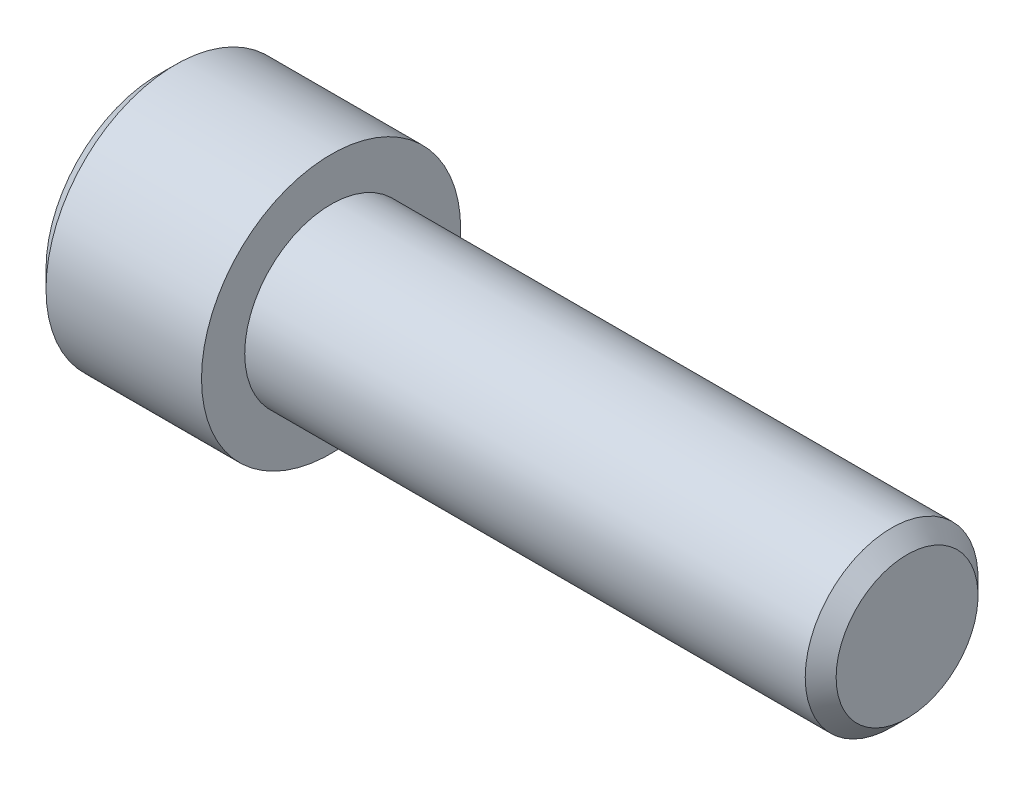
ISO-10303-21;
HEADER;
FILE_DESCRIPTION(('STEP AP214'),'2;1');
FILE_NAME('part.step','',(''),(''),'','','');
FILE_SCHEMA(('AUTOMOTIVE_DESIGN { 1 0 10303 214 1 1 1 1 }'));
ENDSEC;
DATA;
#1=APPLICATION_CONTEXT('core data for automotive mechanical design processes');
#2=APPLICATION_PROTOCOL_DEFINITION('international standard','automotive_design',2000,#1);
#3=PRODUCT_CONTEXT('',#1,'mechanical');
#4=PRODUCT('Part','Part','',(#3));
#5=PRODUCT_RELATED_PRODUCT_CATEGORY('part','',(#4));
#6=PRODUCT_DEFINITION_FORMATION('','',#4);
#7=PRODUCT_DEFINITION_CONTEXT('part definition',#1,'design');
#8=PRODUCT_DEFINITION('design','',#6,#7);
#9=PRODUCT_DEFINITION_SHAPE('','',#8);
#10=(LENGTH_UNIT() NAMED_UNIT(*) SI_UNIT(.MILLI.,.METRE.));
#11=(NAMED_UNIT(*) PLANE_ANGLE_UNIT() SI_UNIT($,.RADIAN.));
#12=(NAMED_UNIT(*) SI_UNIT($,.STERADIAN.) SOLID_ANGLE_UNIT());
#13=UNCERTAINTY_MEASURE_WITH_UNIT(LENGTH_MEASURE(1.E-05),#10,'distance_accuracy_value','');
#14=(GEOMETRIC_REPRESENTATION_CONTEXT(3) GLOBAL_UNCERTAINTY_ASSIGNED_CONTEXT((#13)) GLOBAL_UNIT_ASSIGNED_CONTEXT((#10,
#11,#12)) REPRESENTATION_CONTEXT('',''));
#15=CARTESIAN_POINT('',(0.,0.,0.));
#16=DIRECTION('',(0.,0.,1.));
#17=DIRECTION('',(1.,0.,0.));
#18=AXIS2_PLACEMENT_3D('',#15,#16,#17);
#19=CARTESIAN_POINT('',(-6.00000000000023,0.,0.));
#20=DIRECTION('',(-1.,0.,0.));
#21=DIRECTION('',(0.,-1.,0.));
#22=AXIS2_PLACEMENT_3D('',#19,#20,#21);
#23=CONICAL_SURFACE('',#22,4.99999999999545,1.30899693900325);
#24=CARTESIAN_POINT('',(-4.66025403790127,0.,5.6843418860808E-11));
#25=VERTEX_POINT('',#24);
#26=VERTEX_LOOP('',#25);
#27=FACE_BOUND('',#26,.T.);
#28=CARTESIAN_POINT('',(-6.00000000000023,0.,0.));
#29=DIRECTION('',(-1.,0.,0.));
#30=DIRECTION('',(0.,-1.,0.));
#31=AXIS2_PLACEMENT_3D('',#28,#29,#30);
#32=CIRCLE('',#31,4.99999999999545);
#33=CARTESIAN_POINT('',(-6.00000000000011,4.33012701892022,-2.49999999999886));
#34=VERTEX_POINT('',#33);
#35=CARTESIAN_POINT('',(-6.00000000000011,0.,-4.99999999999773));
#36=VERTEX_POINT('',#35);
#37=EDGE_CURVE('E152',#34,#36,#32,.T.);
#38=ORIENTED_EDGE('',*,*,#37,.T.);
#39=CARTESIAN_POINT('',(-6.00000000000023,0.,0.));
#40=DIRECTION('',(-1.,0.,0.));
#41=DIRECTION('',(0.,-1.,0.));
#42=AXIS2_PLACEMENT_3D('',#39,#40,#41);
#43=CIRCLE('',#42,4.99999999999545);
#44=CARTESIAN_POINT('',(-6.00000000000011,-4.33012701892022,-2.49999999999887));
#45=VERTEX_POINT('',#44);
#46=EDGE_CURVE('E136',#36,#45,#43,.T.);
#47=ORIENTED_EDGE('',*,*,#46,.T.);
#48=CARTESIAN_POINT('',(-6.00000000000023,0.,0.));
#49=DIRECTION('',(-1.,0.,0.));
#50=DIRECTION('',(0.,-1.,0.));
#51=AXIS2_PLACEMENT_3D('',#48,#49,#50);
#52=CIRCLE('',#51,4.99999999999545);
#53=CARTESIAN_POINT('',(-6.00000000000011,-4.33012701892022,2.49999999999886));
#54=VERTEX_POINT('',#53);
#55=EDGE_CURVE('E89',#45,#54,#52,.T.);
#56=ORIENTED_EDGE('',*,*,#55,.T.);
#57=CARTESIAN_POINT('',(-6.00000000000023,0.,0.));
#58=DIRECTION('',(-1.,0.,0.));
#59=DIRECTION('',(0.,-1.,0.));
#60=AXIS2_PLACEMENT_3D('',#57,#58,#59);
#61=CIRCLE('',#60,4.99999999999545);
#62=CARTESIAN_POINT('',(-6.00000000000011,0.,4.99999999999773));
#63=VERTEX_POINT('',#62);
#64=EDGE_CURVE('E20',#54,#63,#61,.T.);
#65=ORIENTED_EDGE('',*,*,#64,.T.);
#66=CARTESIAN_POINT('',(-6.00000000000023,0.,0.));
#67=DIRECTION('',(-1.,0.,0.));
#68=DIRECTION('',(0.,-1.,0.));
#69=AXIS2_PLACEMENT_3D('',#66,#67,#68);
#70=CIRCLE('',#69,4.99999999999545);
#71=CARTESIAN_POINT('',(-6.00000000000011,4.33012701892022,2.49999999999887));
#72=VERTEX_POINT('',#71);
#73=EDGE_CURVE('E92',#63,#72,#70,.T.);
#74=ORIENTED_EDGE('',*,*,#73,.T.);
#75=CARTESIAN_POINT('',(-6.00000000000023,0.,0.));
#76=DIRECTION('',(-1.,0.,0.));
#77=DIRECTION('',(0.,-1.,0.));
#78=AXIS2_PLACEMENT_3D('',#75,#76,#77);
#79=CIRCLE('',#78,4.99999999999545);
#80=EDGE_CURVE('E106',#72,#34,#79,.T.);
#81=ORIENTED_EDGE('',*,*,#80,.T.);
#82=EDGE_LOOP('',(#38,#47,#56,#65,#74,#81));
#83=FACE_BOUND('',#82,.T.);
#84=ADVANCED_FACE('F17',(#27,#83),#23,.F.);
#85=CARTESIAN_POINT('',(-6.,0.,0.));
#86=DIRECTION('',(1.,0.,0.));
#87=DIRECTION('',(0.,0.,-1.));
#88=AXIS2_PLACEMENT_3D('',#85,#86,#87);
#89=PLANE('',#88);
#90=DIRECTION('',(0.,0.5,0.866025403784439));
#91=VECTOR('',#90,1.);
#92=CARTESIAN_POINT('',(-6.,-2.88675134594813,5.));
#93=LINE('',#92,#91);
#94=CARTESIAN_POINT('',(-6.,-2.88675134594813,5.));
#95=VERTEX_POINT('',#94);
#96=EDGE_CURVE('E111',#95,#54,#93,.F.);
#97=ORIENTED_EDGE('',*,*,#96,.F.);
#98=DIRECTION('',(0.,1.,0.));
#99=VECTOR('',#98,1.);
#100=CARTESIAN_POINT('',(-6.,2.88675134594813,5.));
#101=LINE('',#100,#99);
#102=EDGE_CURVE('E108',#63,#95,#101,.F.);
#103=ORIENTED_EDGE('',*,*,#102,.F.);
#104=ORIENTED_EDGE('',*,*,#64,.F.);
#105=EDGE_LOOP('',(#97,#103,#104));
#106=FACE_BOUND('',#105,.T.);
#107=ADVANCED_FACE('F109',(#106),#89,.F.);
#108=CARTESIAN_POINT('',(-6.,0.,0.));
#109=DIRECTION('',(1.,0.,0.));
#110=DIRECTION('',(0.,0.,-1.));
#111=AXIS2_PLACEMENT_3D('',#108,#109,#110);
#112=PLANE('',#111);
#113=DIRECTION('',(0.,1.,0.));
#114=VECTOR('',#113,1.);
#115=CARTESIAN_POINT('',(-6.,2.88675134594813,5.));
#116=LINE('',#115,#114);
#117=CARTESIAN_POINT('',(-6.,2.88675134594813,5.));
#118=VERTEX_POINT('',#117);
#119=EDGE_CURVE('E101',#118,#63,#116,.F.);
#120=ORIENTED_EDGE('',*,*,#119,.F.);
#121=DIRECTION('',(0.,0.5,-0.866025403784439));
#122=VECTOR('',#121,1.);
#123=CARTESIAN_POINT('',(-6.,5.77350269189626,0.));
#124=LINE('',#123,#122);
#125=EDGE_CURVE('E104',#72,#118,#124,.F.);
#126=ORIENTED_EDGE('',*,*,#125,.F.);
#127=ORIENTED_EDGE('',*,*,#73,.F.);
#128=EDGE_LOOP('',(#120,#126,#127));
#129=FACE_BOUND('',#128,.T.);
#130=ADVANCED_FACE('F99',(#129),#112,.F.);
#131=CARTESIAN_POINT('',(-6.,0.,0.));
#132=DIRECTION('',(1.,0.,0.));
#133=DIRECTION('',(0.,0.,-1.));
#134=AXIS2_PLACEMENT_3D('',#131,#132,#133);
#135=PLANE('',#134);
#136=ORIENTED_EDGE('',*,*,#80,.F.);
#137=DIRECTION('',(0.,0.5,-0.866025403784439));
#138=VECTOR('',#137,1.);
#139=CARTESIAN_POINT('',(-6.,5.77350269189626,0.));
#140=LINE('',#139,#138);
#141=CARTESIAN_POINT('',(-6.,5.77350269189626,0.));
#142=VERTEX_POINT('',#141);
#143=EDGE_CURVE('E132',#142,#72,#140,.F.);
#144=ORIENTED_EDGE('',*,*,#143,.F.);
#145=DIRECTION('',(0.,-0.5,-0.866025403784439));
#146=VECTOR('',#145,1.);
#147=CARTESIAN_POINT('',(-6.,2.88675134594813,-5.));
#148=LINE('',#147,#146);
#149=EDGE_CURVE('E168',#34,#142,#148,.F.);
#150=ORIENTED_EDGE('',*,*,#149,.F.);
#151=EDGE_LOOP('',(#136,#144,#150));
#152=FACE_BOUND('',#151,.T.);
#153=ADVANCED_FACE('F169',(#152),#135,.F.);
#154=CARTESIAN_POINT('',(-6.,0.,0.));
#155=DIRECTION('',(1.,0.,0.));
#156=DIRECTION('',(0.,0.,-1.));
#157=AXIS2_PLACEMENT_3D('',#154,#155,#156);
#158=PLANE('',#157);
#159=DIRECTION('',(0.,-0.5,-0.866025403784439));
#160=VECTOR('',#159,1.);
#161=CARTESIAN_POINT('',(-6.,2.88675134594813,-5.));
#162=LINE('',#161,#160);
#163=CARTESIAN_POINT('',(-6.,2.88675134594813,-5.));
#164=VERTEX_POINT('',#163);
#165=EDGE_CURVE('E162',#164,#34,#162,.F.);
#166=ORIENTED_EDGE('',*,*,#165,.F.);
#167=DIRECTION('',(0.,1.,0.));
#168=VECTOR('',#167,1.);
#169=CARTESIAN_POINT('',(-6.,-2.88675134594813,-5.));
#170=LINE('',#169,#168);
#171=EDGE_CURVE('E165',#36,#164,#170,.T.);
#172=ORIENTED_EDGE('',*,*,#171,.F.);
#173=ORIENTED_EDGE('',*,*,#37,.F.);
#174=EDGE_LOOP('',(#166,#172,#173));
#175=FACE_BOUND('',#174,.T.);
#176=ADVANCED_FACE('F160',(#175),#158,.F.);
#177=CARTESIAN_POINT('',(-6.,0.,0.));
#178=DIRECTION('',(1.,0.,0.));
#179=DIRECTION('',(0.,0.,-1.));
#180=AXIS2_PLACEMENT_3D('',#177,#178,#179);
#181=PLANE('',#180);
#182=DIRECTION('',(0.,-0.5,0.866025403784439));
#183=VECTOR('',#182,1.);
#184=CARTESIAN_POINT('',(-6.,-5.77350269189626,0.));
#185=LINE('',#184,#183);
#186=CARTESIAN_POINT('',(-6.,-5.77350269189626,0.));
#187=VERTEX_POINT('',#186);
#188=EDGE_CURVE('E214',#187,#45,#185,.F.);
#189=ORIENTED_EDGE('',*,*,#188,.F.);
#190=DIRECTION('',(0.,0.5,0.866025403784439));
#191=VECTOR('',#190,1.);
#192=CARTESIAN_POINT('',(-6.,-2.88675134594813,5.));
#193=LINE('',#192,#191);
#194=EDGE_CURVE('E120',#54,#187,#193,.F.);
#195=ORIENTED_EDGE('',*,*,#194,.F.);
#196=ORIENTED_EDGE('',*,*,#55,.F.);
#197=EDGE_LOOP('',(#189,#195,#196));
#198=FACE_BOUND('',#197,.T.);
#199=ADVANCED_FACE('F253',(#198),#181,.F.);
#200=CARTESIAN_POINT('',(-6.,0.,0.));
#201=DIRECTION('',(1.,0.,0.));
#202=DIRECTION('',(0.,0.,-1.));
#203=AXIS2_PLACEMENT_3D('',#200,#201,#202);
#204=PLANE('',#203);
#205=DIRECTION('',(0.,1.,0.));
#206=VECTOR('',#205,1.);
#207=CARTESIAN_POINT('',(-6.,-2.88675134594813,-5.));
#208=LINE('',#207,#206);
#209=CARTESIAN_POINT('',(-6.,-2.88675134594813,-5.));
#210=VERTEX_POINT('',#209);
#211=EDGE_CURVE('E187',#210,#36,#208,.T.);
#212=ORIENTED_EDGE('',*,*,#211,.F.);
#213=DIRECTION('',(0.,-0.5,0.866025403784439));
#214=VECTOR('',#213,1.);
#215=CARTESIAN_POINT('',(-6.,-5.77350269189626,0.));
#216=LINE('',#215,#214);
#217=EDGE_CURVE('E217',#45,#210,#216,.F.);
#218=ORIENTED_EDGE('',*,*,#217,.F.);
#219=ORIENTED_EDGE('',*,*,#46,.F.);
#220=EDGE_LOOP('',(#212,#218,#219));
#221=FACE_BOUND('',#220,.T.);
#222=ADVANCED_FACE('F250',(#221),#204,.F.);
#223=CARTESIAN_POINT('',(-6.,-2.88675134594813,5.));
#224=DIRECTION('',(0.,0.866025403784439,-0.5));
#225=DIRECTION('',(0.,0.5,0.866025403784439));
#226=AXIS2_PLACEMENT_3D('',#223,#224,#225);
#227=PLANE('',#226);
#228=ORIENTED_EDGE('',*,*,#194,.T.);
#229=DIRECTION('',(1.,0.,0.));
#230=VECTOR('',#229,1.);
#231=CARTESIAN_POINT('',(-6.,-5.77350269189626,0.));
#232=LINE('',#231,#230);
#233=CARTESIAN_POINT('',(-12.,-5.77350269189626,0.));
#234=VERTEX_POINT('',#233);
#235=EDGE_CURVE('E218',#234,#187,#232,.T.);
#236=ORIENTED_EDGE('',*,*,#235,.F.);
#237=DIRECTION('',(0.,0.5,0.866025403784439));
#238=VECTOR('',#237,1.);
#239=CARTESIAN_POINT('',(-12.,-5.77350269189626,0.));
#240=LINE('',#239,#238);
#241=CARTESIAN_POINT('',(-12.,-2.88675134594813,5.));
#242=VERTEX_POINT('',#241);
#243=EDGE_CURVE('E213',#234,#242,#240,.T.);
#244=ORIENTED_EDGE('',*,*,#243,.T.);
#245=DIRECTION('',(-1.,0.,0.));
#246=VECTOR('',#245,1.);
#247=CARTESIAN_POINT('',(-6.,-2.88675134594813,5.));
#248=LINE('',#247,#246);
#249=EDGE_CURVE('E115',#95,#242,#248,.T.);
#250=ORIENTED_EDGE('',*,*,#249,.F.);
#251=ORIENTED_EDGE('',*,*,#96,.T.);
#252=EDGE_LOOP('',(#228,#236,#244,#250,#251));
#253=FACE_BOUND('',#252,.T.);
#254=ADVANCED_FACE('F255',(#253),#227,.T.);
#255=CARTESIAN_POINT('',(-6.,2.88675134594813,5.));
#256=DIRECTION('',(0.,0.,-1.));
#257=DIRECTION('',(-1.,0.,0.));
#258=AXIS2_PLACEMENT_3D('',#255,#256,#257);
#259=PLANE('',#258);
#260=ORIENTED_EDGE('',*,*,#102,.T.);
#261=ORIENTED_EDGE('',*,*,#249,.T.);
#262=DIRECTION('',(0.,1.,0.));
#263=VECTOR('',#262,1.);
#264=CARTESIAN_POINT('',(-12.,0.,5.));
#265=LINE('',#264,#263);
#266=CARTESIAN_POINT('',(-12.,2.88675134594813,5.));
#267=VERTEX_POINT('',#266);
#268=EDGE_CURVE('E208',#242,#267,#265,.T.);
#269=ORIENTED_EDGE('',*,*,#268,.T.);
#270=DIRECTION('',(1.,0.,0.));
#271=VECTOR('',#270,1.);
#272=CARTESIAN_POINT('',(-6.,2.88675134594813,5.));
#273=LINE('',#272,#271);
#274=EDGE_CURVE('E119',#118,#267,#273,.F.);
#275=ORIENTED_EDGE('',*,*,#274,.F.);
#276=ORIENTED_EDGE('',*,*,#119,.T.);
#277=EDGE_LOOP('',(#260,#261,#269,#275,#276));
#278=FACE_BOUND('',#277,.T.);
#279=ADVANCED_FACE('F117',(#278),#259,.T.);
#280=CARTESIAN_POINT('',(-6.,5.77350269189626,0.));
#281=DIRECTION('',(0.,-0.866025403784439,-0.5));
#282=DIRECTION('',(0.,0.5,-0.866025403784439));
#283=AXIS2_PLACEMENT_3D('',#280,#281,#282);
#284=PLANE('',#283);
#285=ORIENTED_EDGE('',*,*,#125,.T.);
#286=ORIENTED_EDGE('',*,*,#274,.T.);
#287=DIRECTION('',(0.,0.5,-0.866025403784439));
#288=VECTOR('',#287,1.);
#289=CARTESIAN_POINT('',(-12.,2.88675134594813,5.));
#290=LINE('',#289,#288);
#291=CARTESIAN_POINT('',(-12.,5.77350269189626,0.));
#292=VERTEX_POINT('',#291);
#293=EDGE_CURVE('E198',#267,#292,#290,.T.);
#294=ORIENTED_EDGE('',*,*,#293,.T.);
#295=DIRECTION('',(1.,0.,0.));
#296=VECTOR('',#295,1.);
#297=CARTESIAN_POINT('',(-6.,5.77350269189626,0.));
#298=LINE('',#297,#296);
#299=EDGE_CURVE('E173',#142,#292,#298,.F.);
#300=ORIENTED_EDGE('',*,*,#299,.F.);
#301=ORIENTED_EDGE('',*,*,#143,.T.);
#302=EDGE_LOOP('',(#285,#286,#294,#300,#301));
#303=FACE_BOUND('',#302,.T.);
#304=ADVANCED_FACE('F196',(#303),#284,.T.);
#305=CARTESIAN_POINT('',(-6.,2.88675134594813,-5.));
#306=DIRECTION('',(0.,-0.866025403784439,0.5));
#307=DIRECTION('',(0.,-0.5,-0.866025403784439));
#308=AXIS2_PLACEMENT_3D('',#305,#306,#307);
#309=PLANE('',#308);
#310=ORIENTED_EDGE('',*,*,#149,.T.);
#311=ORIENTED_EDGE('',*,*,#299,.T.);
#312=DIRECTION('',(0.,-0.5,-0.866025403784439));
#313=VECTOR('',#312,1.);
#314=CARTESIAN_POINT('',(-12.,5.77350269189626,0.));
#315=LINE('',#314,#313);
#316=CARTESIAN_POINT('',(-12.,2.88675134594813,-5.));
#317=VERTEX_POINT('',#316);
#318=EDGE_CURVE('E200',#292,#317,#315,.T.);
#319=ORIENTED_EDGE('',*,*,#318,.T.);
#320=DIRECTION('',(1.,0.,0.));
#321=VECTOR('',#320,1.);
#322=CARTESIAN_POINT('',(-6.,2.88675134594813,-5.));
#323=LINE('',#322,#321);
#324=EDGE_CURVE('E176',#164,#317,#323,.F.);
#325=ORIENTED_EDGE('',*,*,#324,.F.);
#326=ORIENTED_EDGE('',*,*,#165,.T.);
#327=EDGE_LOOP('',(#310,#311,#319,#325,#326));
#328=FACE_BOUND('',#327,.T.);
#329=ADVANCED_FACE('F175',(#328),#309,.T.);
#330=CARTESIAN_POINT('',(-6.,-2.88675134594813,-5.));
#331=DIRECTION('',(0.,0.,1.));
#332=DIRECTION('',(1.,0.,0.));
#333=AXIS2_PLACEMENT_3D('',#330,#331,#332);
#334=PLANE('',#333);
#335=ORIENTED_EDGE('',*,*,#171,.T.);
#336=ORIENTED_EDGE('',*,*,#324,.T.);
#337=DIRECTION('',(0.,1.,0.));
#338=VECTOR('',#337,1.);
#339=CARTESIAN_POINT('',(-12.,0.,-5.));
#340=LINE('',#339,#338);
#341=CARTESIAN_POINT('',(-12.,-2.88675134594813,-5.));
#342=VERTEX_POINT('',#341);
#343=EDGE_CURVE('E35',#317,#342,#340,.F.);
#344=ORIENTED_EDGE('',*,*,#343,.T.);
#345=DIRECTION('',(1.,0.,0.));
#346=VECTOR('',#345,1.);
#347=CARTESIAN_POINT('',(-6.,-2.88675134594813,-5.));
#348=LINE('',#347,#346);
#349=EDGE_CURVE('E223',#210,#342,#348,.F.);
#350=ORIENTED_EDGE('',*,*,#349,.F.);
#351=ORIENTED_EDGE('',*,*,#211,.T.);
#352=EDGE_LOOP('',(#335,#336,#344,#350,#351));
#353=FACE_BOUND('',#352,.T.);
#354=ADVANCED_FACE('F247',(#353),#334,.T.);
#355=CARTESIAN_POINT('',(-6.,-5.77350269189626,0.));
#356=DIRECTION('',(0.,0.866025403784439,0.5));
#357=DIRECTION('',(0.,-0.5,0.866025403784439));
#358=AXIS2_PLACEMENT_3D('',#355,#356,#357);
#359=PLANE('',#358);
#360=ORIENTED_EDGE('',*,*,#217,.T.);
#361=ORIENTED_EDGE('',*,*,#349,.T.);
#362=DIRECTION('',(0.,-0.5,0.866025403784439));
#363=VECTOR('',#362,1.);
#364=CARTESIAN_POINT('',(-12.,-2.88675134594813,-5.));
#365=LINE('',#364,#363);
#366=EDGE_CURVE('E149',#342,#234,#365,.T.);
#367=ORIENTED_EDGE('',*,*,#366,.T.);
#368=ORIENTED_EDGE('',*,*,#235,.T.);
#369=ORIENTED_EDGE('',*,*,#188,.T.);
#370=EDGE_LOOP('',(#360,#361,#367,#368,#369));
#371=FACE_BOUND('',#370,.T.);
#372=ADVANCED_FACE('F258',(#371),#359,.T.);
#373=CARTESIAN_POINT('',(-12.,0.,0.));
#374=DIRECTION('',(1.,0.,0.));
#375=DIRECTION('',(0.,0.,-1.));
#376=AXIS2_PLACEMENT_3D('',#373,#374,#375);
#377=PLANE('',#376);
#378=ORIENTED_EDGE('',*,*,#343,.F.);
#379=ORIENTED_EDGE('',*,*,#318,.F.);
#380=ORIENTED_EDGE('',*,*,#293,.F.);
#381=ORIENTED_EDGE('',*,*,#268,.F.);
#382=ORIENTED_EDGE('',*,*,#243,.F.);
#383=ORIENTED_EDGE('',*,*,#366,.F.);
#384=EDGE_LOOP('',(#378,#379,#380,#381,#382,#383));
#385=FACE_BOUND('',#384,.T.);
#386=CARTESIAN_POINT('',(-12.,0.,0.));
#387=DIRECTION('',(1.,0.,0.));
#388=DIRECTION('',(0.,0.,-1.));
#389=AXIS2_PLACEMENT_3D('',#386,#387,#388);
#390=CIRCLE('',#389,7.8);
#391=CARTESIAN_POINT('',(-12.,0.,-7.8));
#392=VERTEX_POINT('',#391);
#393=EDGE_CURVE('E146',#392,#392,#390,.T.);
#394=ORIENTED_EDGE('',*,*,#393,.F.);
#395=EDGE_LOOP('',(#394));
#396=FACE_BOUND('',#395,.T.);
#397=ADVANCED_FACE('F202',(#385,#396),#377,.F.);
#398=CARTESIAN_POINT('',(-10.8000000000031,0.,0.));
#399=DIRECTION('',(1.,0.,0.));
#400=DIRECTION('',(0.,0.,-1.));
#401=AXIS2_PLACEMENT_3D('',#398,#399,#400);
#402=CONICAL_SURFACE('',#401,9.00000000000306,0.7853981634);
#403=ORIENTED_EDGE('',*,*,#393,.T.);
#404=EDGE_LOOP('',(#403));
#405=FACE_BOUND('',#404,.T.);
#406=CARTESIAN_POINT('',(-10.8,0.,0.));
#407=DIRECTION('',(-1.,0.,0.));
#408=DIRECTION('',(0.,0.,1.));
#409=AXIS2_PLACEMENT_3D('',#406,#407,#408);
#410=CIRCLE('',#409,9.);
#411=CARTESIAN_POINT('',(-10.8,0.,9.));
#412=VERTEX_POINT('',#411);
#413=EDGE_CURVE('E145',#412,#412,#410,.F.);
#414=ORIENTED_EDGE('',*,*,#413,.F.);
#415=EDGE_LOOP('',(#414));
#416=FACE_BOUND('',#415,.T.);
#417=ADVANCED_FACE('F266',(#405,#416),#402,.T.);
#418=CARTESIAN_POINT('',(40.,4.9265,0.));
#419=DIRECTION('',(-1.,0.,0.));
#420=DIRECTION('',(0.,0.,1.));
#421=AXIS2_PLACEMENT_3D('',#418,#419,#420);
#422=PLANE('',#421);
#423=CARTESIAN_POINT('',(39.9999999999636,0.,0.));
#424=DIRECTION('',(-1.,0.,0.));
#425=DIRECTION('',(0.,0.,1.));
#426=AXIS2_PLACEMENT_3D('',#423,#424,#425);
#427=CIRCLE('',#426,4.92649999995365);
#428=CARTESIAN_POINT('',(39.9999999999636,0.,4.92649999995365));
#429=VERTEX_POINT('',#428);
#430=EDGE_CURVE('E142',#429,#429,#427,.T.);
#431=ORIENTED_EDGE('',*,*,#430,.F.);
#432=EDGE_LOOP('',(#431));
#433=FACE_BOUND('',#432,.T.);
#434=ADVANCED_FACE('F288',(#433),#422,.F.);
#435=CARTESIAN_POINT('',(40.,0.,0.));
#436=DIRECTION('',(-1.,0.,0.));
#437=DIRECTION('',(0.,0.,1.));
#438=AXIS2_PLACEMENT_3D('',#435,#436,#437);
#439=CYLINDRICAL_SURFACE('',#438,9.);
#440=ORIENTED_EDGE('',*,*,#413,.T.);
#441=EDGE_LOOP('',(#440));
#442=FACE_BOUND('',#441,.T.);
#443=CARTESIAN_POINT('',(0.,0.,0.));
#444=DIRECTION('',(-1.,0.,0.));
#445=DIRECTION('',(0.,0.,1.));
#446=AXIS2_PLACEMENT_3D('',#443,#444,#445);
#447=CIRCLE('',#446,9.);
#448=CARTESIAN_POINT('',(0.,0.,9.));
#449=VERTEX_POINT('',#448);
#450=EDGE_CURVE('E139',#449,#449,#447,.T.);
#451=ORIENTED_EDGE('',*,*,#450,.T.);
#452=EDGE_LOOP('',(#451));
#453=FACE_BOUND('',#452,.T.);
#454=ADVANCED_FACE('F284',(#442,#453),#439,.T.);
#455=CARTESIAN_POINT('',(38.9264999999455,0.,0.));
#456=DIRECTION('',(-1.,0.,0.));
#457=DIRECTION('',(0.,0.,1.));
#458=AXIS2_PLACEMENT_3D('',#455,#456,#457);
#459=CONICAL_SURFACE('',#458,5.99999999997181,0.785398163397448);
#460=CARTESIAN_POINT('',(38.9265,0.,0.));
#461=DIRECTION('',(-1.,0.,0.));
#462=DIRECTION('',(0.,0.,1.));
#463=AXIS2_PLACEMENT_3D('',#460,#461,#462);
#464=CIRCLE('',#463,6.);
#465=CARTESIAN_POINT('',(38.9265,0.,6.));
#466=VERTEX_POINT('',#465);
#467=EDGE_CURVE('E26',#466,#466,#464,.T.);
#468=ORIENTED_EDGE('',*,*,#467,.F.);
#469=EDGE_LOOP('',(#468));
#470=FACE_BOUND('',#469,.T.);
#471=ORIENTED_EDGE('',*,*,#430,.T.);
#472=EDGE_LOOP('',(#471));
#473=FACE_BOUND('',#472,.T.);
#474=ADVANCED_FACE('F277',(#470,#473),#459,.T.);
#475=CARTESIAN_POINT('',(0.,9.,0.));
#476=DIRECTION('',(-1.,0.,0.));
#477=DIRECTION('',(0.,0.,1.));
#478=AXIS2_PLACEMENT_3D('',#475,#476,#477);
#479=PLANE('',#478);
#480=ORIENTED_EDGE('',*,*,#450,.F.);
#481=EDGE_LOOP('',(#480));
#482=FACE_BOUND('',#481,.T.);
#483=CARTESIAN_POINT('',(0.,0.,0.));
#484=DIRECTION('',(-1.,0.,0.));
#485=DIRECTION('',(0.,0.,1.));
#486=AXIS2_PLACEMENT_3D('',#483,#484,#485);
#487=CIRCLE('',#486,6.);
#488=CARTESIAN_POINT('',(0.,0.,6.));
#489=VERTEX_POINT('',#488);
#490=EDGE_CURVE('E11',#489,#489,#487,.F.);
#491=ORIENTED_EDGE('',*,*,#490,.F.);
#492=EDGE_LOOP('',(#491));
#493=FACE_BOUND('',#492,.T.);
#494=ADVANCED_FACE('F271',(#482,#493),#479,.F.);
#495=CARTESIAN_POINT('',(40.,0.,0.));
#496=DIRECTION('',(-1.,0.,0.));
#497=DIRECTION('',(0.,0.,1.));
#498=AXIS2_PLACEMENT_3D('',#495,#496,#497);
#499=CYLINDRICAL_SURFACE('',#498,6.);
#500=ORIENTED_EDGE('',*,*,#490,.T.);
#501=EDGE_LOOP('',(#500));
#502=FACE_BOUND('',#501,.T.);
#503=ORIENTED_EDGE('',*,*,#467,.T.);
#504=EDGE_LOOP('',(#503));
#505=FACE_BOUND('',#504,.T.);
#506=ADVANCED_FACE('F269',(#502,#505),#499,.T.);
#507=CLOSED_SHELL('',(#84,#107,#130,#153,#176,#199,#222,#254,#279,#304,#329,#354,#372,#397,#417,
#434,#454,#474,#494,#506));
#508=MANIFOLD_SOLID_BREP('B1',#507);
#509=ADVANCED_BREP_SHAPE_REPRESENTATION('',(#18,#508),#14);
#510=SHAPE_DEFINITION_REPRESENTATION(#9,#509);
ENDSEC;
END-ISO-10303-21;
